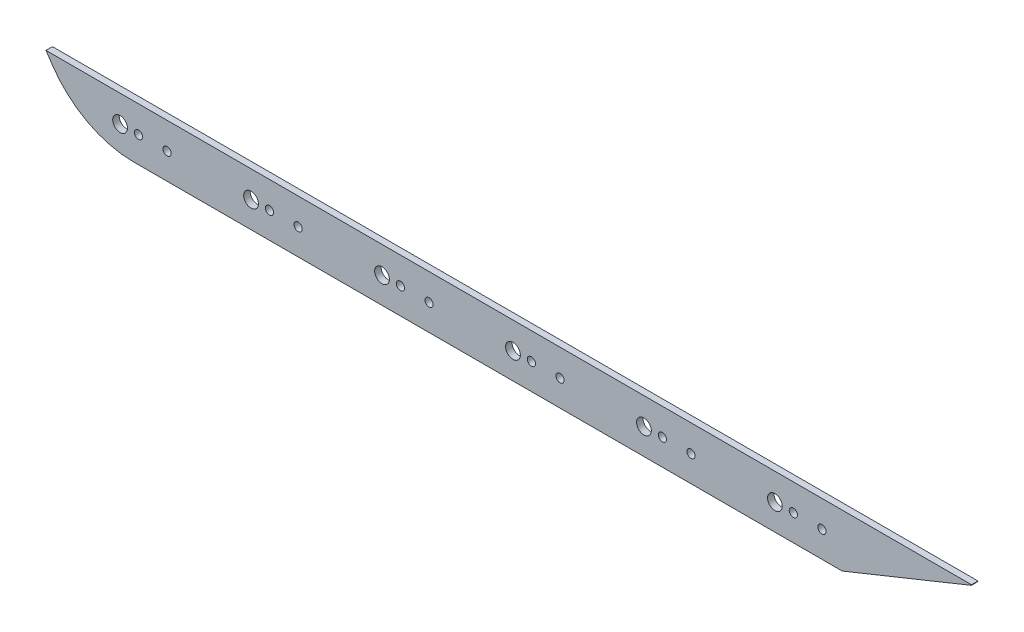
ISO-10303-21;
HEADER;
FILE_DESCRIPTION(('STEP AP214'),'2;1');
FILE_NAME('part.step','',(''),(''),'','','');
FILE_SCHEMA(('AUTOMOTIVE_DESIGN { 1 0 10303 214 1 1 1 1 }'));
ENDSEC;
DATA;
#1=APPLICATION_CONTEXT('core data for automotive mechanical design processes');
#2=APPLICATION_PROTOCOL_DEFINITION('international standard','automotive_design',2000,#1);
#3=PRODUCT_CONTEXT('',#1,'mechanical');
#4=PRODUCT('Part','Part','',(#3));
#5=PRODUCT_RELATED_PRODUCT_CATEGORY('part','',(#4));
#6=PRODUCT_DEFINITION_FORMATION('','',#4);
#7=PRODUCT_DEFINITION_CONTEXT('part definition',#1,'design');
#8=PRODUCT_DEFINITION('design','',#6,#7);
#9=PRODUCT_DEFINITION_SHAPE('','',#8);
#10=(LENGTH_UNIT() NAMED_UNIT(*) SI_UNIT(.MILLI.,.METRE.));
#11=(NAMED_UNIT(*) PLANE_ANGLE_UNIT() SI_UNIT($,.RADIAN.));
#12=(NAMED_UNIT(*) SI_UNIT($,.STERADIAN.) SOLID_ANGLE_UNIT());
#13=UNCERTAINTY_MEASURE_WITH_UNIT(LENGTH_MEASURE(1.E-05),#10,'distance_accuracy_value','');
#14=(GEOMETRIC_REPRESENTATION_CONTEXT(3) GLOBAL_UNCERTAINTY_ASSIGNED_CONTEXT((#13)) GLOBAL_UNIT_ASSIGNED_CONTEXT((#10,
#11,#12)) REPRESENTATION_CONTEXT('',''));
#15=CARTESIAN_POINT('',(0.,0.,0.));
#16=DIRECTION('',(0.,0.,1.));
#17=DIRECTION('',(1.,0.,0.));
#18=AXIS2_PLACEMENT_3D('',#15,#16,#17);
#19=CARTESIAN_POINT('',(428.120588235294,28.9396179466764,3.175));
#20=DIRECTION('',(0.970193019893108,-0.242333456523632,0.));
#21=DIRECTION('',(0.242333456523632,0.970193019893108,0.));
#22=AXIS2_PLACEMENT_3D('',#19,#20,#21);
#23=PLANE('',#22);
#24=DIRECTION('',(0.,0.,1.));
#25=VECTOR('',#24,1.);
#26=CARTESIAN_POINT('',(403.198019602024,-70.8390196078432,-6.825));
#27=LINE('',#26,#25);
#28=CARTESIAN_POINT('',(403.198019602024,-70.8390196078432,0.));
#29=VERTEX_POINT('',#28);
#30=CARTESIAN_POINT('',(403.198019602024,-70.8390196078432,3.175));
#31=VERTEX_POINT('',#30);
#32=EDGE_CURVE('E67',#29,#31,#27,.T.);
#33=ORIENTED_EDGE('',*,*,#32,.T.);
#34=DIRECTION('',(-0.242333456523632,-0.970193019893108,0.));
#35=VECTOR('',#34,1.);
#36=CARTESIAN_POINT('',(428.120588235294,28.9396179466764,3.175));
#37=LINE('',#36,#35);
#38=CARTESIAN_POINT('',(403.120588235294,-71.1490196078431,3.175));
#39=VERTEX_POINT('',#38);
#40=EDGE_CURVE('E120',#31,#39,#37,.T.);
#41=ORIENTED_EDGE('',*,*,#40,.T.);
#42=DIRECTION('',(0.,0.,-1.));
#43=VECTOR('',#42,1.);
#44=CARTESIAN_POINT('',(403.120588235294,-71.1490196078431,3.175));
#45=LINE('',#44,#43);
#46=CARTESIAN_POINT('',(403.120588235294,-71.1490196078431,0.));
#47=VERTEX_POINT('',#46);
#48=EDGE_CURVE('E128',#39,#47,#45,.T.);
#49=ORIENTED_EDGE('',*,*,#48,.T.);
#50=DIRECTION('',(-0.242333456523632,-0.970193019893108,0.));
#51=VECTOR('',#50,1.);
#52=CARTESIAN_POINT('',(428.120588235294,28.9396179466764,0.));
#53=LINE('',#52,#51);
#54=EDGE_CURVE('E140',#29,#47,#53,.T.);
#55=ORIENTED_EDGE('',*,*,#54,.F.);
#56=EDGE_LOOP('',(#33,#41,#49,#55));
#57=FACE_BOUND('',#56,.T.);
#58=ADVANCED_FACE('F49',(#57),#23,.T.);
#59=CARTESIAN_POINT('',(-98.8794117647059,3.85098039215685,3.175));
#60=DIRECTION('',(-0.832050294337848,-0.554700196225223,0.));
#61=DIRECTION('',(0.554700196225223,-0.832050294337848,0.));
#62=AXIS2_PLACEMENT_3D('',#59,#60,#61);
#63=PLANE('',#62);
#64=DIRECTION('',(0.,0.,1.));
#65=VECTOR('',#64,1.);
#66=CARTESIAN_POINT('',(-49.0860784313726,-70.8390196078432,-6.825));
#67=LINE('',#66,#65);
#68=CARTESIAN_POINT('',(-49.0860784313726,-70.8390196078432,0.));
#69=VERTEX_POINT('',#68);
#70=CARTESIAN_POINT('',(-49.0860784313726,-70.8390196078432,3.175));
#71=VERTEX_POINT('',#70);
#72=EDGE_CURVE('E103',#69,#71,#67,.T.);
#73=ORIENTED_EDGE('',*,*,#72,.F.);
#74=DIRECTION('',(-0.554700196225223,0.832050294337848,0.));
#75=VECTOR('',#74,1.);
#76=CARTESIAN_POINT('',(-98.8794117647059,3.85098039215685,0.));
#77=LINE('',#76,#75);
#78=CARTESIAN_POINT('',(-46.1290054854995,-75.2746290266539,0.));
#79=VERTEX_POINT('',#78);
#80=EDGE_CURVE('E148',#79,#69,#77,.T.);
#81=ORIENTED_EDGE('',*,*,#80,.F.);
#82=DIRECTION('',(0.,0.,-1.));
#83=VECTOR('',#82,1.);
#84=CARTESIAN_POINT('',(-46.1290054854995,-75.2746290266539,3.175));
#85=LINE('',#84,#83);
#86=CARTESIAN_POINT('',(-46.129005485499,-75.2746290266536,3.175));
#87=VERTEX_POINT('',#86);
#88=EDGE_CURVE('E125',#79,#87,#85,.F.);
#89=ORIENTED_EDGE('',*,*,#88,.T.);
#90=DIRECTION('',(0.554700196225229,-0.832050294337844,0.));
#91=VECTOR('',#90,1.);
#92=CARTESIAN_POINT('',(-98.8794117647059,3.85098039215685,3.175));
#93=LINE('',#92,#91);
#94=EDGE_CURVE('E117',#71,#87,#93,.T.);
#95=ORIENTED_EDGE('',*,*,#94,.F.);
#96=EDGE_LOOP('',(#73,#81,#89,#95));
#97=FACE_BOUND('',#96,.T.);
#98=ADVANCED_FACE('F123',(#97),#63,.T.);
#99=CARTESIAN_POINT('',(-31.8794117647059,-96.6490196078432,3.175));
#100=DIRECTION('',(0.,1.,0.));
#101=DIRECTION('',(-1.,0.,0.));
#102=AXIS2_PLACEMENT_3D('',#99,#100,#101);
#103=PLANE('',#102);
#104=DIRECTION('',(1.,0.,0.));
#105=VECTOR('',#104,1.);
#106=CARTESIAN_POINT('',(-31.8794117647059,-96.6490196078432,0.));
#107=LINE('',#106,#105);
#108=CARTESIAN_POINT('',(-6.19059135728281,-96.6490196078432,0.));
#109=VERTEX_POINT('',#108);
#110=CARTESIAN_POINT('',(340.005873473177,-96.6490196078432,0.));
#111=VERTEX_POINT('',#110);
#112=EDGE_CURVE('E143',#109,#111,#107,.T.);
#113=ORIENTED_EDGE('',*,*,#112,.T.);
#114=DIRECTION('',(0.,0.,1.));
#115=VECTOR('',#114,1.);
#116=CARTESIAN_POINT('',(340.005873473177,-96.6490196078432,-6.825));
#117=LINE('',#116,#115);
#118=CARTESIAN_POINT('',(340.005873473177,-96.6490196078432,3.175));
#119=VERTEX_POINT('',#118);
#120=EDGE_CURVE('E74',#111,#119,#117,.T.);
#121=ORIENTED_EDGE('',*,*,#120,.T.);
#122=DIRECTION('',(1.,0.,0.));
#123=VECTOR('',#122,1.);
#124=CARTESIAN_POINT('',(-31.8794117647059,-96.6490196078432,3.175));
#125=LINE('',#124,#123);
#126=CARTESIAN_POINT('',(-6.19059135728281,-96.6490196078432,3.175));
#127=VERTEX_POINT('',#126);
#128=EDGE_CURVE('E129',#127,#119,#125,.T.);
#129=ORIENTED_EDGE('',*,*,#128,.F.);
#130=DIRECTION('',(0.,0.,-1.));
#131=VECTOR('',#130,1.);
#132=CARTESIAN_POINT('',(-6.19059135728281,-96.6490196078432,0.));
#133=LINE('',#132,#131);
#134=EDGE_CURVE('E134',#127,#109,#133,.T.);
#135=ORIENTED_EDGE('',*,*,#134,.T.);
#136=EDGE_LOOP('',(#113,#121,#129,#135));
#137=FACE_BOUND('',#136,.T.);
#138=ADVANCED_FACE('F233',(#137),#103,.F.);
#139=CARTESIAN_POINT('',(0.,0.,3.175));
#140=DIRECTION('',(0.,0.,1.));
#141=DIRECTION('',(1.,0.,0.));
#142=AXIS2_PLACEMENT_3D('',#139,#140,#141);
#143=PLANE('',#142);
#144=CARTESIAN_POINT('',(-3.87941176470592,-83.8990196078432,3.175));
#145=DIRECTION('',(0.,0.,1.));
#146=DIRECTION('',(1.,0.,0.));
#147=AXIS2_PLACEMENT_3D('',#144,#145,#146);
#148=CIRCLE('',#147,2.);
#149=CARTESIAN_POINT('',(-1.87941176470592,-83.8990196078432,3.175));
#150=VERTEX_POINT('',#149);
#151=EDGE_CURVE('E169',#150,#150,#148,.T.);
#152=ORIENTED_EDGE('',*,*,#151,.F.);
#153=EDGE_LOOP('',(#152));
#154=FACE_BOUND('',#153,.T.);
#155=CARTESIAN_POINT('',(10.1205882352941,-83.8990196078432,3.175));
#156=DIRECTION('',(0.,0.,1.));
#157=DIRECTION('',(1.,0.,0.));
#158=AXIS2_PLACEMENT_3D('',#155,#156,#157);
#159=CIRCLE('',#158,2.);
#160=CARTESIAN_POINT('',(12.1205882352941,-83.8990196078432,3.175));
#161=VERTEX_POINT('',#160);
#162=EDGE_CURVE('E449',#161,#161,#159,.T.);
#163=ORIENTED_EDGE('',*,*,#162,.F.);
#164=EDGE_LOOP('',(#163));
#165=FACE_BOUND('',#164,.T.);
#166=CARTESIAN_POINT('',(60.1205882352941,-83.8990196078432,3.175));
#167=DIRECTION('',(0.,0.,1.));
#168=DIRECTION('',(1.,0.,0.));
#169=AXIS2_PLACEMENT_3D('',#166,#167,#168);
#170=CIRCLE('',#169,2.);
#171=CARTESIAN_POINT('',(62.1205882352941,-83.8990196078432,3.175));
#172=VERTEX_POINT('',#171);
#173=EDGE_CURVE('E315',#172,#172,#170,.T.);
#174=ORIENTED_EDGE('',*,*,#173,.F.);
#175=EDGE_LOOP('',(#174));
#176=FACE_BOUND('',#175,.T.);
#177=CARTESIAN_POINT('',(74.1205882352941,-83.8990196078432,3.175));
#178=DIRECTION('',(0.,0.,1.));
#179=DIRECTION('',(1.,0.,0.));
#180=AXIS2_PLACEMENT_3D('',#177,#178,#179);
#181=CIRCLE('',#180,2.);
#182=CARTESIAN_POINT('',(76.1205882352941,-83.8990196078432,3.175));
#183=VERTEX_POINT('',#182);
#184=EDGE_CURVE('E443',#183,#183,#181,.T.);
#185=ORIENTED_EDGE('',*,*,#184,.F.);
#186=EDGE_LOOP('',(#185));
#187=FACE_BOUND('',#186,.T.);
#188=CARTESIAN_POINT('',(124.120588235294,-83.8990196078432,3.175));
#189=DIRECTION('',(0.,0.,1.));
#190=DIRECTION('',(1.,0.,0.));
#191=AXIS2_PLACEMENT_3D('',#188,#189,#190);
#192=CIRCLE('',#191,1.99999999999998);
#193=CARTESIAN_POINT('',(126.120588235294,-83.8990196078432,3.175));
#194=VERTEX_POINT('',#193);
#195=EDGE_CURVE('E439',#194,#194,#192,.T.);
#196=ORIENTED_EDGE('',*,*,#195,.F.);
#197=EDGE_LOOP('',(#196));
#198=FACE_BOUND('',#197,.T.);
#199=CARTESIAN_POINT('',(138.120588235294,-83.8990196078432,3.175));
#200=DIRECTION('',(0.,0.,1.));
#201=DIRECTION('',(1.,0.,0.));
#202=AXIS2_PLACEMENT_3D('',#199,#200,#201);
#203=CIRCLE('',#202,2.);
#204=CARTESIAN_POINT('',(140.120588235294,-83.8990196078432,3.175));
#205=VERTEX_POINT('',#204);
#206=EDGE_CURVE('E435',#205,#205,#203,.T.);
#207=ORIENTED_EDGE('',*,*,#206,.F.);
#208=EDGE_LOOP('',(#207));
#209=FACE_BOUND('',#208,.T.);
#210=CARTESIAN_POINT('',(188.120588235294,-83.8990196078432,3.175));
#211=DIRECTION('',(0.,0.,1.));
#212=DIRECTION('',(1.,0.,0.));
#213=AXIS2_PLACEMENT_3D('',#210,#211,#212);
#214=CIRCLE('',#213,2.);
#215=CARTESIAN_POINT('',(190.120588235294,-83.8990196078432,3.175));
#216=VERTEX_POINT('',#215);
#217=EDGE_CURVE('E431',#216,#216,#214,.T.);
#218=ORIENTED_EDGE('',*,*,#217,.F.);
#219=EDGE_LOOP('',(#218));
#220=FACE_BOUND('',#219,.T.);
#221=CARTESIAN_POINT('',(202.120588235294,-83.8990196078432,3.175));
#222=DIRECTION('',(0.,0.,1.));
#223=DIRECTION('',(1.,0.,0.));
#224=AXIS2_PLACEMENT_3D('',#221,#222,#223);
#225=CIRCLE('',#224,2.);
#226=CARTESIAN_POINT('',(204.120588235294,-83.8990196078432,3.175));
#227=VERTEX_POINT('',#226);
#228=EDGE_CURVE('E427',#227,#227,#225,.T.);
#229=ORIENTED_EDGE('',*,*,#228,.F.);
#230=EDGE_LOOP('',(#229));
#231=FACE_BOUND('',#230,.T.);
#232=CARTESIAN_POINT('',(252.120588235294,-83.8990196078432,3.175));
#233=DIRECTION('',(0.,0.,1.));
#234=DIRECTION('',(1.,0.,0.));
#235=AXIS2_PLACEMENT_3D('',#232,#233,#234);
#236=CIRCLE('',#235,2.);
#237=CARTESIAN_POINT('',(254.120588235294,-83.8990196078432,3.175));
#238=VERTEX_POINT('',#237);
#239=EDGE_CURVE('E423',#238,#238,#236,.T.);
#240=ORIENTED_EDGE('',*,*,#239,.F.);
#241=EDGE_LOOP('',(#240));
#242=FACE_BOUND('',#241,.T.);
#243=CARTESIAN_POINT('',(266.120588235294,-83.8990196078432,3.175));
#244=DIRECTION('',(0.,0.,1.));
#245=DIRECTION('',(1.,0.,0.));
#246=AXIS2_PLACEMENT_3D('',#243,#244,#245);
#247=CIRCLE('',#246,2.);
#248=CARTESIAN_POINT('',(268.120588235294,-83.8990196078432,3.175));
#249=VERTEX_POINT('',#248);
#250=EDGE_CURVE('E419',#249,#249,#247,.T.);
#251=ORIENTED_EDGE('',*,*,#250,.F.);
#252=EDGE_LOOP('',(#251));
#253=FACE_BOUND('',#252,.T.);
#254=CARTESIAN_POINT('',(316.120588235294,-83.8990196078432,3.175));
#255=DIRECTION('',(0.,0.,1.));
#256=DIRECTION('',(1.,0.,0.));
#257=AXIS2_PLACEMENT_3D('',#254,#255,#256);
#258=CIRCLE('',#257,2.);
#259=CARTESIAN_POINT('',(318.120588235294,-83.8990196078432,3.175));
#260=VERTEX_POINT('',#259);
#261=EDGE_CURVE('E415',#260,#260,#258,.T.);
#262=ORIENTED_EDGE('',*,*,#261,.F.);
#263=EDGE_LOOP('',(#262));
#264=FACE_BOUND('',#263,.T.);
#265=CARTESIAN_POINT('',(330.120588235294,-83.8990196078432,3.175));
#266=DIRECTION('',(0.,0.,1.));
#267=DIRECTION('',(1.,0.,0.));
#268=AXIS2_PLACEMENT_3D('',#265,#266,#267);
#269=CIRCLE('',#268,2.);
#270=CARTESIAN_POINT('',(332.120588235294,-83.8990196078432,3.175));
#271=VERTEX_POINT('',#270);
#272=EDGE_CURVE('E411',#271,#271,#269,.T.);
#273=ORIENTED_EDGE('',*,*,#272,.F.);
#274=EDGE_LOOP('',(#273));
#275=FACE_BOUND('',#274,.T.);
#276=DIRECTION('',(1.,0.,0.));
#277=VECTOR('',#276,1.);
#278=CARTESIAN_POINT('',(-49.0860784313726,-70.8390196078432,3.175));
#279=LINE('',#278,#277);
#280=EDGE_CURVE('E106',#71,#31,#279,.T.);
#281=ORIENTED_EDGE('',*,*,#280,.F.);
#282=ORIENTED_EDGE('',*,*,#94,.T.);
#283=CARTESIAN_POINT('',(-6.19059135728282,-48.6490196078432,3.175));
#284=DIRECTION('',(0.,0.,1.));
#285=DIRECTION('',(1.,0.,0.));
#286=AXIS2_PLACEMENT_3D('',#283,#284,#285);
#287=CIRCLE('',#286,48.);
#288=EDGE_CURVE('E159',#87,#127,#287,.T.);
#289=ORIENTED_EDGE('',*,*,#288,.T.);
#290=ORIENTED_EDGE('',*,*,#128,.T.);
#291=DIRECTION('',(-0.92718385456679,-0.374606593415906,0.));
#292=VECTOR('',#291,1.);
#293=CARTESIAN_POINT('',(403.120588235294,-71.1490196078431,3.175));
#294=LINE('',#293,#292);
#295=EDGE_CURVE('E368',#39,#119,#294,.T.);
#296=ORIENTED_EDGE('',*,*,#295,.F.);
#297=ORIENTED_EDGE('',*,*,#40,.F.);
#298=EDGE_LOOP('',(#281,#282,#289,#290,#296,#297));
#299=FACE_BOUND('',#298,.T.);
#300=CARTESIAN_POINT('',(-12.8794117647059,-83.8990196078432,3.175));
#301=DIRECTION('',(0.,0.,1.));
#302=DIRECTION('',(1.,0.,0.));
#303=AXIS2_PLACEMENT_3D('',#300,#301,#302);
#304=CIRCLE('',#303,3.6);
#305=CARTESIAN_POINT('',(-9.27941176470592,-83.8990196078432,3.175));
#306=VERTEX_POINT('',#305);
#307=EDGE_CURVE('E144',#306,#306,#304,.T.);
#308=ORIENTED_EDGE('',*,*,#307,.F.);
#309=EDGE_LOOP('',(#308));
#310=FACE_BOUND('',#309,.T.);
#311=CARTESIAN_POINT('',(51.1205882352941,-83.8990196078433,3.175));
#312=DIRECTION('',(0.,0.,1.));
#313=DIRECTION('',(1.,0.,0.));
#314=AXIS2_PLACEMENT_3D('',#311,#312,#313);
#315=CIRCLE('',#314,3.6);
#316=CARTESIAN_POINT('',(54.7205882352941,-83.8990196078433,3.175));
#317=VERTEX_POINT('',#316);
#318=EDGE_CURVE('E383',#317,#317,#315,.T.);
#319=ORIENTED_EDGE('',*,*,#318,.F.);
#320=EDGE_LOOP('',(#319));
#321=FACE_BOUND('',#320,.T.);
#322=CARTESIAN_POINT('',(115.120588235294,-83.8990196078432,3.175));
#323=DIRECTION('',(0.,0.,1.));
#324=DIRECTION('',(1.,0.,0.));
#325=AXIS2_PLACEMENT_3D('',#322,#323,#324);
#326=CIRCLE('',#325,3.6);
#327=CARTESIAN_POINT('',(118.720588235294,-83.8990196078432,3.175));
#328=VERTEX_POINT('',#327);
#329=EDGE_CURVE('E389',#328,#328,#326,.T.);
#330=ORIENTED_EDGE('',*,*,#329,.F.);
#331=EDGE_LOOP('',(#330));
#332=FACE_BOUND('',#331,.T.);
#333=CARTESIAN_POINT('',(179.120588235294,-83.8990196078432,3.175));
#334=DIRECTION('',(0.,0.,1.));
#335=DIRECTION('',(1.,0.,0.));
#336=AXIS2_PLACEMENT_3D('',#333,#334,#335);
#337=CIRCLE('',#336,3.59999999999998);
#338=CARTESIAN_POINT('',(182.720588235294,-83.8990196078432,3.175));
#339=VERTEX_POINT('',#338);
#340=EDGE_CURVE('E395',#339,#339,#337,.T.);
#341=ORIENTED_EDGE('',*,*,#340,.F.);
#342=EDGE_LOOP('',(#341));
#343=FACE_BOUND('',#342,.T.);
#344=CARTESIAN_POINT('',(243.120588235294,-83.8990196078432,3.175));
#345=DIRECTION('',(0.,0.,1.));
#346=DIRECTION('',(1.,0.,0.));
#347=AXIS2_PLACEMENT_3D('',#344,#345,#346);
#348=CIRCLE('',#347,3.59999999999998);
#349=CARTESIAN_POINT('',(246.720588235294,-83.8990196078432,3.175));
#350=VERTEX_POINT('',#349);
#351=EDGE_CURVE('E401',#350,#350,#348,.T.);
#352=ORIENTED_EDGE('',*,*,#351,.F.);
#353=EDGE_LOOP('',(#352));
#354=FACE_BOUND('',#353,.T.);
#355=CARTESIAN_POINT('',(307.120588235294,-83.8990196078432,3.175));
#356=DIRECTION('',(0.,0.,1.));
#357=DIRECTION('',(1.,0.,0.));
#358=AXIS2_PLACEMENT_3D('',#355,#356,#357);
#359=CIRCLE('',#358,3.60000000000001);
#360=CARTESIAN_POINT('',(310.720588235294,-83.8990196078432,3.175));
#361=VERTEX_POINT('',#360);
#362=EDGE_CURVE('E367',#361,#361,#359,.T.);
#363=ORIENTED_EDGE('',*,*,#362,.F.);
#364=EDGE_LOOP('',(#363));
#365=FACE_BOUND('',#364,.T.);
#366=ADVANCED_FACE('F115',(#154,#165,#176,#187,#198,#209,#220,#231,#242,#253,#264,#275,#299,
#310,#321,#332,#343,#354,#365),#143,.T.);
#367=CARTESIAN_POINT('',(0.,0.,0.));
#368=DIRECTION('',(0.,0.,1.));
#369=DIRECTION('',(1.,0.,0.));
#370=AXIS2_PLACEMENT_3D('',#367,#368,#369);
#371=PLANE('',#370);
#372=CARTESIAN_POINT('',(-3.87941176470592,-83.8990196078432,0.));
#373=DIRECTION('',(0.,0.,1.));
#374=DIRECTION('',(1.,0.,0.));
#375=AXIS2_PLACEMENT_3D('',#372,#373,#374);
#376=CIRCLE('',#375,2.);
#377=CARTESIAN_POINT('',(-1.87941176470592,-83.8990196078432,0.));
#378=VERTEX_POINT('',#377);
#379=EDGE_CURVE('E53',#378,#378,#376,.T.);
#380=ORIENTED_EDGE('',*,*,#379,.T.);
#381=EDGE_LOOP('',(#380));
#382=FACE_BOUND('',#381,.T.);
#383=CARTESIAN_POINT('',(10.1205882352941,-83.8990196078432,0.));
#384=DIRECTION('',(0.,0.,1.));
#385=DIRECTION('',(1.,0.,0.));
#386=AXIS2_PLACEMENT_3D('',#383,#384,#385);
#387=CIRCLE('',#386,2.);
#388=CARTESIAN_POINT('',(12.1205882352941,-83.8990196078432,0.));
#389=VERTEX_POINT('',#388);
#390=EDGE_CURVE('E204',#389,#389,#387,.T.);
#391=ORIENTED_EDGE('',*,*,#390,.T.);
#392=EDGE_LOOP('',(#391));
#393=FACE_BOUND('',#392,.T.);
#394=CARTESIAN_POINT('',(60.1205882352941,-83.8990196078432,0.));
#395=DIRECTION('',(0.,0.,1.));
#396=DIRECTION('',(1.,0.,0.));
#397=AXIS2_PLACEMENT_3D('',#394,#395,#396);
#398=CIRCLE('',#397,2.);
#399=CARTESIAN_POINT('',(62.1205882352941,-83.8990196078432,0.));
#400=VERTEX_POINT('',#399);
#401=EDGE_CURVE('E201',#400,#400,#398,.T.);
#402=ORIENTED_EDGE('',*,*,#401,.T.);
#403=EDGE_LOOP('',(#402));
#404=FACE_BOUND('',#403,.T.);
#405=CARTESIAN_POINT('',(74.1205882352941,-83.8990196078432,0.));
#406=DIRECTION('',(0.,0.,1.));
#407=DIRECTION('',(1.,0.,0.));
#408=AXIS2_PLACEMENT_3D('',#405,#406,#407);
#409=CIRCLE('',#408,2.);
#410=CARTESIAN_POINT('',(76.1205882352941,-83.8990196078432,0.));
#411=VERTEX_POINT('',#410);
#412=EDGE_CURVE('E197',#411,#411,#409,.T.);
#413=ORIENTED_EDGE('',*,*,#412,.T.);
#414=EDGE_LOOP('',(#413));
#415=FACE_BOUND('',#414,.T.);
#416=CARTESIAN_POINT('',(124.120588235294,-83.8990196078432,0.));
#417=DIRECTION('',(0.,0.,1.));
#418=DIRECTION('',(1.,0.,0.));
#419=AXIS2_PLACEMENT_3D('',#416,#417,#418);
#420=CIRCLE('',#419,1.99999999999998);
#421=CARTESIAN_POINT('',(126.120588235294,-83.8990196078432,0.));
#422=VERTEX_POINT('',#421);
#423=EDGE_CURVE('E193',#422,#422,#420,.T.);
#424=ORIENTED_EDGE('',*,*,#423,.T.);
#425=EDGE_LOOP('',(#424));
#426=FACE_BOUND('',#425,.T.);
#427=CARTESIAN_POINT('',(138.120588235294,-83.8990196078432,0.));
#428=DIRECTION('',(0.,0.,1.));
#429=DIRECTION('',(1.,0.,0.));
#430=AXIS2_PLACEMENT_3D('',#427,#428,#429);
#431=CIRCLE('',#430,2.);
#432=CARTESIAN_POINT('',(140.120588235294,-83.8990196078432,0.));
#433=VERTEX_POINT('',#432);
#434=EDGE_CURVE('E189',#433,#433,#431,.T.);
#435=ORIENTED_EDGE('',*,*,#434,.T.);
#436=EDGE_LOOP('',(#435));
#437=FACE_BOUND('',#436,.T.);
#438=CARTESIAN_POINT('',(188.120588235294,-83.8990196078432,0.));
#439=DIRECTION('',(0.,0.,1.));
#440=DIRECTION('',(1.,0.,0.));
#441=AXIS2_PLACEMENT_3D('',#438,#439,#440);
#442=CIRCLE('',#441,2.);
#443=CARTESIAN_POINT('',(190.120588235294,-83.8990196078432,0.));
#444=VERTEX_POINT('',#443);
#445=EDGE_CURVE('E185',#444,#444,#442,.T.);
#446=ORIENTED_EDGE('',*,*,#445,.T.);
#447=EDGE_LOOP('',(#446));
#448=FACE_BOUND('',#447,.T.);
#449=CARTESIAN_POINT('',(202.120588235294,-83.8990196078432,0.));
#450=DIRECTION('',(0.,0.,1.));
#451=DIRECTION('',(1.,0.,0.));
#452=AXIS2_PLACEMENT_3D('',#449,#450,#451);
#453=CIRCLE('',#452,2.);
#454=CARTESIAN_POINT('',(204.120588235294,-83.8990196078432,0.));
#455=VERTEX_POINT('',#454);
#456=EDGE_CURVE('E181',#455,#455,#453,.T.);
#457=ORIENTED_EDGE('',*,*,#456,.T.);
#458=EDGE_LOOP('',(#457));
#459=FACE_BOUND('',#458,.T.);
#460=CARTESIAN_POINT('',(252.120588235294,-83.8990196078432,0.));
#461=DIRECTION('',(0.,0.,1.));
#462=DIRECTION('',(1.,0.,0.));
#463=AXIS2_PLACEMENT_3D('',#460,#461,#462);
#464=CIRCLE('',#463,2.);
#465=CARTESIAN_POINT('',(254.120588235294,-83.8990196078432,0.));
#466=VERTEX_POINT('',#465);
#467=EDGE_CURVE('E177',#466,#466,#464,.T.);
#468=ORIENTED_EDGE('',*,*,#467,.T.);
#469=EDGE_LOOP('',(#468));
#470=FACE_BOUND('',#469,.T.);
#471=CARTESIAN_POINT('',(266.120588235294,-83.8990196078432,0.));
#472=DIRECTION('',(0.,0.,1.));
#473=DIRECTION('',(1.,0.,0.));
#474=AXIS2_PLACEMENT_3D('',#471,#472,#473);
#475=CIRCLE('',#474,2.);
#476=CARTESIAN_POINT('',(268.120588235294,-83.8990196078432,0.));
#477=VERTEX_POINT('',#476);
#478=EDGE_CURVE('E173',#477,#477,#475,.T.);
#479=ORIENTED_EDGE('',*,*,#478,.T.);
#480=EDGE_LOOP('',(#479));
#481=FACE_BOUND('',#480,.T.);
#482=CARTESIAN_POINT('',(316.120588235294,-83.8990196078432,0.));
#483=DIRECTION('',(0.,0.,1.));
#484=DIRECTION('',(1.,0.,0.));
#485=AXIS2_PLACEMENT_3D('',#482,#483,#484);
#486=CIRCLE('',#485,2.);
#487=CARTESIAN_POINT('',(318.120588235294,-83.8990196078432,0.));
#488=VERTEX_POINT('',#487);
#489=EDGE_CURVE('E168',#488,#488,#486,.T.);
#490=ORIENTED_EDGE('',*,*,#489,.T.);
#491=EDGE_LOOP('',(#490));
#492=FACE_BOUND('',#491,.T.);
#493=CARTESIAN_POINT('',(330.120588235294,-83.8990196078432,0.));
#494=DIRECTION('',(0.,0.,1.));
#495=DIRECTION('',(1.,0.,0.));
#496=AXIS2_PLACEMENT_3D('',#493,#494,#495);
#497=CIRCLE('',#496,2.);
#498=CARTESIAN_POINT('',(332.120588235294,-83.8990196078432,0.));
#499=VERTEX_POINT('',#498);
#500=EDGE_CURVE('E164',#499,#499,#497,.T.);
#501=ORIENTED_EDGE('',*,*,#500,.T.);
#502=EDGE_LOOP('',(#501));
#503=FACE_BOUND('',#502,.T.);
#504=CARTESIAN_POINT('',(-12.8794117647059,-83.8990196078432,0.));
#505=DIRECTION('',(0.,0.,1.));
#506=DIRECTION('',(1.,0.,0.));
#507=AXIS2_PLACEMENT_3D('',#504,#505,#506);
#508=CIRCLE('',#507,3.6);
#509=CARTESIAN_POINT('',(-9.27941176470592,-83.8990196078432,0.));
#510=VERTEX_POINT('',#509);
#511=EDGE_CURVE('E340',#510,#510,#508,.T.);
#512=ORIENTED_EDGE('',*,*,#511,.T.);
#513=EDGE_LOOP('',(#512));
#514=FACE_BOUND('',#513,.T.);
#515=CARTESIAN_POINT('',(51.1205882352941,-83.8990196078433,0.));
#516=DIRECTION('',(0.,0.,1.));
#517=DIRECTION('',(1.,0.,0.));
#518=AXIS2_PLACEMENT_3D('',#515,#516,#517);
#519=CIRCLE('',#518,3.6);
#520=CARTESIAN_POINT('',(54.7205882352941,-83.8990196078433,0.));
#521=VERTEX_POINT('',#520);
#522=EDGE_CURVE('E344',#521,#521,#519,.T.);
#523=ORIENTED_EDGE('',*,*,#522,.T.);
#524=EDGE_LOOP('',(#523));
#525=FACE_BOUND('',#524,.T.);
#526=CARTESIAN_POINT('',(115.120588235294,-83.8990196078432,0.));
#527=DIRECTION('',(0.,0.,1.));
#528=DIRECTION('',(1.,0.,0.));
#529=AXIS2_PLACEMENT_3D('',#526,#527,#528);
#530=CIRCLE('',#529,3.6);
#531=CARTESIAN_POINT('',(118.720588235294,-83.8990196078432,0.));
#532=VERTEX_POINT('',#531);
#533=EDGE_CURVE('E348',#532,#532,#530,.T.);
#534=ORIENTED_EDGE('',*,*,#533,.T.);
#535=EDGE_LOOP('',(#534));
#536=FACE_BOUND('',#535,.T.);
#537=CARTESIAN_POINT('',(179.120588235294,-83.8990196078432,0.));
#538=DIRECTION('',(0.,0.,1.));
#539=DIRECTION('',(1.,0.,0.));
#540=AXIS2_PLACEMENT_3D('',#537,#538,#539);
#541=CIRCLE('',#540,3.59999999999998);
#542=CARTESIAN_POINT('',(182.720588235294,-83.8990196078432,0.));
#543=VERTEX_POINT('',#542);
#544=EDGE_CURVE('E352',#543,#543,#541,.T.);
#545=ORIENTED_EDGE('',*,*,#544,.T.);
#546=EDGE_LOOP('',(#545));
#547=FACE_BOUND('',#546,.T.);
#548=CARTESIAN_POINT('',(243.120588235294,-83.8990196078432,0.));
#549=DIRECTION('',(0.,0.,1.));
#550=DIRECTION('',(1.,0.,0.));
#551=AXIS2_PLACEMENT_3D('',#548,#549,#550);
#552=CIRCLE('',#551,3.59999999999998);
#553=CARTESIAN_POINT('',(246.720588235294,-83.8990196078432,0.));
#554=VERTEX_POINT('',#553);
#555=EDGE_CURVE('E356',#554,#554,#552,.T.);
#556=ORIENTED_EDGE('',*,*,#555,.T.);
#557=EDGE_LOOP('',(#556));
#558=FACE_BOUND('',#557,.T.);
#559=CARTESIAN_POINT('',(307.120588235294,-83.8990196078432,0.));
#560=DIRECTION('',(0.,0.,1.));
#561=DIRECTION('',(1.,0.,0.));
#562=AXIS2_PLACEMENT_3D('',#559,#560,#561);
#563=CIRCLE('',#562,3.60000000000001);
#564=CARTESIAN_POINT('',(310.720588235294,-83.8990196078432,0.));
#565=VERTEX_POINT('',#564);
#566=EDGE_CURVE('E360',#565,#565,#563,.T.);
#567=ORIENTED_EDGE('',*,*,#566,.T.);
#568=EDGE_LOOP('',(#567));
#569=FACE_BOUND('',#568,.T.);
#570=ORIENTED_EDGE('',*,*,#80,.T.);
#571=DIRECTION('',(1.,0.,0.));
#572=VECTOR('',#571,1.);
#573=CARTESIAN_POINT('',(0.,-70.8390196078432,0.));
#574=LINE('',#573,#572);
#575=EDGE_CURVE('E11',#69,#29,#574,.T.);
#576=ORIENTED_EDGE('',*,*,#575,.T.);
#577=ORIENTED_EDGE('',*,*,#54,.T.);
#578=DIRECTION('',(-0.92718385456679,-0.374606593415906,0.));
#579=VECTOR('',#578,1.);
#580=CARTESIAN_POINT('',(81.2820834011268,-201.180216044419,0.));
#581=LINE('',#580,#579);
#582=EDGE_CURVE('E59',#47,#111,#581,.T.);
#583=ORIENTED_EDGE('',*,*,#582,.T.);
#584=ORIENTED_EDGE('',*,*,#112,.F.);
#585=CARTESIAN_POINT('',(-6.19059135728282,-48.6490196078432,0.));
#586=DIRECTION('',(0.,0.,1.));
#587=DIRECTION('',(1.,0.,0.));
#588=AXIS2_PLACEMENT_3D('',#585,#586,#587);
#589=CIRCLE('',#588,48.);
#590=EDGE_CURVE('E154',#109,#79,#589,.F.);
#591=ORIENTED_EDGE('',*,*,#590,.T.);
#592=EDGE_LOOP('',(#570,#576,#577,#583,#584,#591));
#593=FACE_BOUND('',#592,.T.);
#594=ADVANCED_FACE('F213',(#382,#393,#404,#415,#426,#437,#448,#459,#470,#481,#492,#503,#514,
#525,#536,#547,#558,#569,#593),#371,.F.);
#595=CARTESIAN_POINT('',(307.120588235294,-83.8990196078432,3.175));
#596=DIRECTION('',(0.,0.,-1.));
#597=DIRECTION('',(-1.,0.,0.));
#598=AXIS2_PLACEMENT_3D('',#595,#596,#597);
#599=CYLINDRICAL_SURFACE('',#598,3.60000000000001);
#600=ORIENTED_EDGE('',*,*,#362,.T.);
#601=EDGE_LOOP('',(#600));
#602=FACE_BOUND('',#601,.T.);
#603=ORIENTED_EDGE('',*,*,#566,.F.);
#604=EDGE_LOOP('',(#603));
#605=FACE_BOUND('',#604,.T.);
#606=ADVANCED_FACE('F241',(#602,#605),#599,.F.);
#607=CARTESIAN_POINT('',(243.120588235294,-83.8990196078432,3.175));
#608=DIRECTION('',(0.,0.,-1.));
#609=DIRECTION('',(-1.,0.,0.));
#610=AXIS2_PLACEMENT_3D('',#607,#608,#609);
#611=CYLINDRICAL_SURFACE('',#610,3.59999999999998);
#612=ORIENTED_EDGE('',*,*,#351,.T.);
#613=EDGE_LOOP('',(#612));
#614=FACE_BOUND('',#613,.T.);
#615=ORIENTED_EDGE('',*,*,#555,.F.);
#616=EDGE_LOOP('',(#615));
#617=FACE_BOUND('',#616,.T.);
#618=ADVANCED_FACE('F247',(#614,#617),#611,.F.);
#619=CARTESIAN_POINT('',(179.120588235294,-83.8990196078432,3.175));
#620=DIRECTION('',(0.,0.,-1.));
#621=DIRECTION('',(-1.,0.,0.));
#622=AXIS2_PLACEMENT_3D('',#619,#620,#621);
#623=CYLINDRICAL_SURFACE('',#622,3.59999999999998);
#624=ORIENTED_EDGE('',*,*,#340,.T.);
#625=EDGE_LOOP('',(#624));
#626=FACE_BOUND('',#625,.T.);
#627=ORIENTED_EDGE('',*,*,#544,.F.);
#628=EDGE_LOOP('',(#627));
#629=FACE_BOUND('',#628,.T.);
#630=ADVANCED_FACE('F251',(#626,#629),#623,.F.);
#631=CARTESIAN_POINT('',(115.120588235294,-83.8990196078432,3.175));
#632=DIRECTION('',(0.,0.,-1.));
#633=DIRECTION('',(-1.,0.,0.));
#634=AXIS2_PLACEMENT_3D('',#631,#632,#633);
#635=CYLINDRICAL_SURFACE('',#634,3.6);
#636=ORIENTED_EDGE('',*,*,#329,.T.);
#637=EDGE_LOOP('',(#636));
#638=FACE_BOUND('',#637,.T.);
#639=ORIENTED_EDGE('',*,*,#533,.F.);
#640=EDGE_LOOP('',(#639));
#641=FACE_BOUND('',#640,.T.);
#642=ADVANCED_FACE('F255',(#638,#641),#635,.F.);
#643=CARTESIAN_POINT('',(51.1205882352941,-83.8990196078433,3.175));
#644=DIRECTION('',(0.,0.,-1.));
#645=DIRECTION('',(-1.,0.,0.));
#646=AXIS2_PLACEMENT_3D('',#643,#644,#645);
#647=CYLINDRICAL_SURFACE('',#646,3.6);
#648=ORIENTED_EDGE('',*,*,#318,.T.);
#649=EDGE_LOOP('',(#648));
#650=FACE_BOUND('',#649,.T.);
#651=ORIENTED_EDGE('',*,*,#522,.F.);
#652=EDGE_LOOP('',(#651));
#653=FACE_BOUND('',#652,.T.);
#654=ADVANCED_FACE('F259',(#650,#653),#647,.F.);
#655=CARTESIAN_POINT('',(-12.8794117647059,-83.8990196078432,3.175));
#656=DIRECTION('',(0.,0.,-1.));
#657=DIRECTION('',(-1.,0.,0.));
#658=AXIS2_PLACEMENT_3D('',#655,#656,#657);
#659=CYLINDRICAL_SURFACE('',#658,3.6);
#660=ORIENTED_EDGE('',*,*,#307,.T.);
#661=EDGE_LOOP('',(#660));
#662=FACE_BOUND('',#661,.T.);
#663=ORIENTED_EDGE('',*,*,#511,.F.);
#664=EDGE_LOOP('',(#663));
#665=FACE_BOUND('',#664,.T.);
#666=ADVANCED_FACE('F263',(#662,#665),#659,.F.);
#667=CARTESIAN_POINT('',(-6.19059135728282,-48.6490196078432,3.175));
#668=DIRECTION('',(0.,0.,1.));
#669=DIRECTION('',(1.,0.,0.));
#670=AXIS2_PLACEMENT_3D('',#667,#668,#669);
#671=CYLINDRICAL_SURFACE('',#670,48.);
#672=ORIENTED_EDGE('',*,*,#288,.F.);
#673=ORIENTED_EDGE('',*,*,#88,.F.);
#674=ORIENTED_EDGE('',*,*,#590,.F.);
#675=ORIENTED_EDGE('',*,*,#134,.F.);
#676=EDGE_LOOP('',(#672,#673,#674,#675));
#677=FACE_BOUND('',#676,.T.);
#678=ADVANCED_FACE('F51',(#677),#671,.T.);
#679=CARTESIAN_POINT('',(403.120588235294,-71.1490196078431,-6.825));
#680=DIRECTION('',(-0.374606593415906,0.92718385456679,0.));
#681=DIRECTION('',(-0.92718385456679,-0.374606593415906,0.));
#682=AXIS2_PLACEMENT_3D('',#679,#680,#681);
#683=PLANE('',#682);
#684=ORIENTED_EDGE('',*,*,#48,.F.);
#685=ORIENTED_EDGE('',*,*,#295,.T.);
#686=ORIENTED_EDGE('',*,*,#120,.F.);
#687=ORIENTED_EDGE('',*,*,#582,.F.);
#688=EDGE_LOOP('',(#684,#685,#686,#687));
#689=FACE_BOUND('',#688,.T.);
#690=ADVANCED_FACE('F268',(#689),#683,.F.);
#691=CARTESIAN_POINT('',(-49.0860784313726,-70.8390196078432,-6.825));
#692=DIRECTION('',(0.,-1.,0.));
#693=DIRECTION('',(0.,0.,-1.));
#694=AXIS2_PLACEMENT_3D('',#691,#692,#693);
#695=PLANE('',#694);
#696=ORIENTED_EDGE('',*,*,#72,.T.);
#697=ORIENTED_EDGE('',*,*,#280,.T.);
#698=ORIENTED_EDGE('',*,*,#32,.F.);
#699=ORIENTED_EDGE('',*,*,#575,.F.);
#700=EDGE_LOOP('',(#696,#697,#698,#699));
#701=FACE_BOUND('',#700,.T.);
#702=ADVANCED_FACE('F105',(#701),#695,.F.);
#703=CARTESIAN_POINT('',(330.120588235294,-83.8990196078432,-6.825));
#704=DIRECTION('',(0.,0.,1.));
#705=DIRECTION('',(1.,0.,0.));
#706=AXIS2_PLACEMENT_3D('',#703,#704,#705);
#707=CYLINDRICAL_SURFACE('',#706,2.);
#708=ORIENTED_EDGE('',*,*,#272,.T.);
#709=EDGE_LOOP('',(#708));
#710=FACE_BOUND('',#709,.T.);
#711=ORIENTED_EDGE('',*,*,#500,.F.);
#712=EDGE_LOOP('',(#711));
#713=FACE_BOUND('',#712,.T.);
#714=ADVANCED_FACE('F272',(#710,#713),#707,.F.);
#715=CARTESIAN_POINT('',(316.120588235294,-83.8990196078432,-6.825));
#716=DIRECTION('',(0.,0.,1.));
#717=DIRECTION('',(1.,0.,0.));
#718=AXIS2_PLACEMENT_3D('',#715,#716,#717);
#719=CYLINDRICAL_SURFACE('',#718,2.);
#720=ORIENTED_EDGE('',*,*,#261,.T.);
#721=EDGE_LOOP('',(#720));
#722=FACE_BOUND('',#721,.T.);
#723=ORIENTED_EDGE('',*,*,#489,.F.);
#724=EDGE_LOOP('',(#723));
#725=FACE_BOUND('',#724,.T.);
#726=ADVANCED_FACE('F275',(#722,#725),#719,.F.);
#727=CARTESIAN_POINT('',(266.120588235294,-83.8990196078432,-6.825));
#728=DIRECTION('',(0.,0.,1.));
#729=DIRECTION('',(1.,0.,0.));
#730=AXIS2_PLACEMENT_3D('',#727,#728,#729);
#731=CYLINDRICAL_SURFACE('',#730,2.);
#732=ORIENTED_EDGE('',*,*,#250,.T.);
#733=EDGE_LOOP('',(#732));
#734=FACE_BOUND('',#733,.T.);
#735=ORIENTED_EDGE('',*,*,#478,.F.);
#736=EDGE_LOOP('',(#735));
#737=FACE_BOUND('',#736,.T.);
#738=ADVANCED_FACE('F279',(#734,#737),#731,.F.);
#739=CARTESIAN_POINT('',(252.120588235294,-83.8990196078432,-6.825));
#740=DIRECTION('',(0.,0.,1.));
#741=DIRECTION('',(1.,0.,0.));
#742=AXIS2_PLACEMENT_3D('',#739,#740,#741);
#743=CYLINDRICAL_SURFACE('',#742,2.);
#744=ORIENTED_EDGE('',*,*,#239,.T.);
#745=EDGE_LOOP('',(#744));
#746=FACE_BOUND('',#745,.T.);
#747=ORIENTED_EDGE('',*,*,#467,.F.);
#748=EDGE_LOOP('',(#747));
#749=FACE_BOUND('',#748,.T.);
#750=ADVANCED_FACE('F283',(#746,#749),#743,.F.);
#751=CARTESIAN_POINT('',(202.120588235294,-83.8990196078432,-6.825));
#752=DIRECTION('',(0.,0.,1.));
#753=DIRECTION('',(1.,0.,0.));
#754=AXIS2_PLACEMENT_3D('',#751,#752,#753);
#755=CYLINDRICAL_SURFACE('',#754,2.);
#756=ORIENTED_EDGE('',*,*,#228,.T.);
#757=EDGE_LOOP('',(#756));
#758=FACE_BOUND('',#757,.T.);
#759=ORIENTED_EDGE('',*,*,#456,.F.);
#760=EDGE_LOOP('',(#759));
#761=FACE_BOUND('',#760,.T.);
#762=ADVANCED_FACE('F287',(#758,#761),#755,.F.);
#763=CARTESIAN_POINT('',(188.120588235294,-83.8990196078432,-6.825));
#764=DIRECTION('',(0.,0.,1.));
#765=DIRECTION('',(1.,0.,0.));
#766=AXIS2_PLACEMENT_3D('',#763,#764,#765);
#767=CYLINDRICAL_SURFACE('',#766,2.);
#768=ORIENTED_EDGE('',*,*,#217,.T.);
#769=EDGE_LOOP('',(#768));
#770=FACE_BOUND('',#769,.T.);
#771=ORIENTED_EDGE('',*,*,#445,.F.);
#772=EDGE_LOOP('',(#771));
#773=FACE_BOUND('',#772,.T.);
#774=ADVANCED_FACE('F291',(#770,#773),#767,.F.);
#775=CARTESIAN_POINT('',(138.120588235294,-83.8990196078432,-6.825));
#776=DIRECTION('',(0.,0.,1.));
#777=DIRECTION('',(1.,0.,0.));
#778=AXIS2_PLACEMENT_3D('',#775,#776,#777);
#779=CYLINDRICAL_SURFACE('',#778,2.);
#780=ORIENTED_EDGE('',*,*,#206,.T.);
#781=EDGE_LOOP('',(#780));
#782=FACE_BOUND('',#781,.T.);
#783=ORIENTED_EDGE('',*,*,#434,.F.);
#784=EDGE_LOOP('',(#783));
#785=FACE_BOUND('',#784,.T.);
#786=ADVANCED_FACE('F295',(#782,#785),#779,.F.);
#787=CARTESIAN_POINT('',(124.120588235294,-83.8990196078432,-6.825));
#788=DIRECTION('',(0.,0.,1.));
#789=DIRECTION('',(1.,0.,0.));
#790=AXIS2_PLACEMENT_3D('',#787,#788,#789);
#791=CYLINDRICAL_SURFACE('',#790,1.99999999999998);
#792=ORIENTED_EDGE('',*,*,#195,.T.);
#793=EDGE_LOOP('',(#792));
#794=FACE_BOUND('',#793,.T.);
#795=ORIENTED_EDGE('',*,*,#423,.F.);
#796=EDGE_LOOP('',(#795));
#797=FACE_BOUND('',#796,.T.);
#798=ADVANCED_FACE('F299',(#794,#797),#791,.F.);
#799=CARTESIAN_POINT('',(74.1205882352941,-83.8990196078432,-6.825));
#800=DIRECTION('',(0.,0.,1.));
#801=DIRECTION('',(1.,0.,0.));
#802=AXIS2_PLACEMENT_3D('',#799,#800,#801);
#803=CYLINDRICAL_SURFACE('',#802,2.);
#804=ORIENTED_EDGE('',*,*,#184,.T.);
#805=EDGE_LOOP('',(#804));
#806=FACE_BOUND('',#805,.T.);
#807=ORIENTED_EDGE('',*,*,#412,.F.);
#808=EDGE_LOOP('',(#807));
#809=FACE_BOUND('',#808,.T.);
#810=ADVANCED_FACE('F303',(#806,#809),#803,.F.);
#811=CARTESIAN_POINT('',(60.1205882352941,-83.8990196078432,-6.825));
#812=DIRECTION('',(0.,0.,1.));
#813=DIRECTION('',(1.,0.,0.));
#814=AXIS2_PLACEMENT_3D('',#811,#812,#813);
#815=CYLINDRICAL_SURFACE('',#814,2.);
#816=ORIENTED_EDGE('',*,*,#173,.T.);
#817=EDGE_LOOP('',(#816));
#818=FACE_BOUND('',#817,.T.);
#819=ORIENTED_EDGE('',*,*,#401,.F.);
#820=EDGE_LOOP('',(#819));
#821=FACE_BOUND('',#820,.T.);
#822=ADVANCED_FACE('F223',(#818,#821),#815,.F.);
#823=CARTESIAN_POINT('',(10.1205882352941,-83.8990196078432,-6.825));
#824=DIRECTION('',(0.,0.,1.));
#825=DIRECTION('',(1.,0.,0.));
#826=AXIS2_PLACEMENT_3D('',#823,#824,#825);
#827=CYLINDRICAL_SURFACE('',#826,2.);
#828=ORIENTED_EDGE('',*,*,#162,.T.);
#829=EDGE_LOOP('',(#828));
#830=FACE_BOUND('',#829,.T.);
#831=ORIENTED_EDGE('',*,*,#390,.F.);
#832=EDGE_LOOP('',(#831));
#833=FACE_BOUND('',#832,.T.);
#834=ADVANCED_FACE('F217',(#830,#833),#827,.F.);
#835=CARTESIAN_POINT('',(-3.87941176470592,-83.8990196078432,-6.825));
#836=DIRECTION('',(0.,0.,1.));
#837=DIRECTION('',(1.,0.,0.));
#838=AXIS2_PLACEMENT_3D('',#835,#836,#837);
#839=CYLINDRICAL_SURFACE('',#838,2.);
#840=ORIENTED_EDGE('',*,*,#151,.T.);
#841=EDGE_LOOP('',(#840));
#842=FACE_BOUND('',#841,.T.);
#843=ORIENTED_EDGE('',*,*,#379,.F.);
#844=EDGE_LOOP('',(#843));
#845=FACE_BOUND('',#844,.T.);
#846=ADVANCED_FACE('F215',(#842,#845),#839,.F.);
#847=CLOSED_SHELL('',(#58,#98,#138,#366,#594,#606,#618,#630,#642,#654,#666,#678,#690,#702,#714,
#726,#738,#750,#762,#774,#786,#798,#810,#822,#834,#846));
#848=MANIFOLD_SOLID_BREP('B2',#847);
#849=ADVANCED_BREP_SHAPE_REPRESENTATION('',(#18,#848),#14);
#850=SHAPE_DEFINITION_REPRESENTATION(#9,#849);
ENDSEC;
END-ISO-10303-21;
